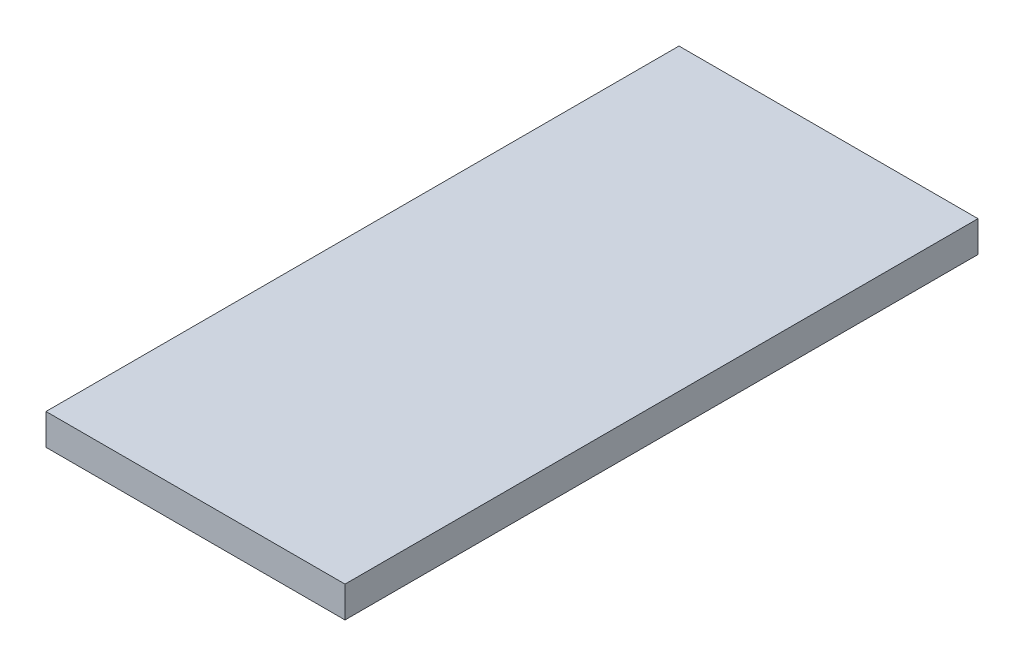
ISO-10303-21;
HEADER;
FILE_DESCRIPTION(('STEP AP214'),'2;1');
FILE_NAME('part.step','',(''),(''),'','','');
FILE_SCHEMA(('AUTOMOTIVE_DESIGN { 1 0 10303 214 1 1 1 1 }'));
ENDSEC;
DATA;
#1=APPLICATION_CONTEXT('core data for automotive mechanical design processes');
#2=APPLICATION_PROTOCOL_DEFINITION('international standard','automotive_design',2000,#1);
#3=PRODUCT_CONTEXT('',#1,'mechanical');
#4=PRODUCT('Part','Part','',(#3));
#5=PRODUCT_RELATED_PRODUCT_CATEGORY('part','',(#4));
#6=PRODUCT_DEFINITION_FORMATION('','',#4);
#7=PRODUCT_DEFINITION_CONTEXT('part definition',#1,'design');
#8=PRODUCT_DEFINITION('design','',#6,#7);
#9=PRODUCT_DEFINITION_SHAPE('','',#8);
#10=(LENGTH_UNIT() NAMED_UNIT(*) SI_UNIT(.MILLI.,.METRE.));
#11=(NAMED_UNIT(*) PLANE_ANGLE_UNIT() SI_UNIT($,.RADIAN.));
#12=(NAMED_UNIT(*) SI_UNIT($,.STERADIAN.) SOLID_ANGLE_UNIT());
#13=UNCERTAINTY_MEASURE_WITH_UNIT(LENGTH_MEASURE(1.E-05),#10,'distance_accuracy_value','');
#14=(GEOMETRIC_REPRESENTATION_CONTEXT(3) GLOBAL_UNCERTAINTY_ASSIGNED_CONTEXT((#13)) GLOBAL_UNIT_ASSIGNED_CONTEXT((#10,
#11,#12)) REPRESENTATION_CONTEXT('',''));
#15=CARTESIAN_POINT('',(0.,0.,0.));
#16=DIRECTION('',(0.,0.,1.));
#17=DIRECTION('',(1.,0.,0.));
#18=AXIS2_PLACEMENT_3D('',#15,#16,#17);
#19=CARTESIAN_POINT('',(0.,8.,0.));
#20=DIRECTION('',(1.,0.,0.));
#21=DIRECTION('',(0.,0.,-1.));
#22=AXIS2_PLACEMENT_3D('',#19,#20,#21);
#23=PLANE('',#22);
#24=DIRECTION('',(0.,0.,1.));
#25=VECTOR('',#24,1.);
#26=CARTESIAN_POINT('',(0.,0.,0.));
#27=LINE('',#26,#25);
#28=CARTESIAN_POINT('',(0.,0.,0.));
#29=VERTEX_POINT('',#28);
#30=CARTESIAN_POINT('',(0.,0.,163.));
#31=VERTEX_POINT('',#30);
#32=EDGE_CURVE('E102',#29,#31,#27,.T.);
#33=ORIENTED_EDGE('',*,*,#32,.T.);
#34=DIRECTION('',(0.,-1.,0.));
#35=VECTOR('',#34,1.);
#36=CARTESIAN_POINT('',(0.,8.,163.));
#37=LINE('',#36,#35);
#38=CARTESIAN_POINT('',(0.,8.,163.));
#39=VERTEX_POINT('',#38);
#40=EDGE_CURVE('E11',#39,#31,#37,.T.);
#41=ORIENTED_EDGE('',*,*,#40,.F.);
#42=DIRECTION('',(0.,0.,1.));
#43=VECTOR('',#42,1.);
#44=CARTESIAN_POINT('',(0.,8.,0.));
#45=LINE('',#44,#43);
#46=CARTESIAN_POINT('',(0.,8.,0.));
#47=VERTEX_POINT('',#46);
#48=EDGE_CURVE('E90',#47,#39,#45,.T.);
#49=ORIENTED_EDGE('',*,*,#48,.F.);
#50=DIRECTION('',(0.,-1.,0.));
#51=VECTOR('',#50,1.);
#52=CARTESIAN_POINT('',(0.,8.,0.));
#53=LINE('',#52,#51);
#54=EDGE_CURVE('E98',#47,#29,#53,.T.);
#55=ORIENTED_EDGE('',*,*,#54,.T.);
#56=EDGE_LOOP('',(#33,#41,#49,#55));
#57=FACE_BOUND('',#56,.T.);
#58=ADVANCED_FACE('F39',(#57),#23,.F.);
#59=CARTESIAN_POINT('',(0.,8.,163.));
#60=DIRECTION('',(0.,0.,-1.));
#61=DIRECTION('',(-1.,0.,0.));
#62=AXIS2_PLACEMENT_3D('',#59,#60,#61);
#63=PLANE('',#62);
#64=DIRECTION('',(1.,0.,0.));
#65=VECTOR('',#64,1.);
#66=CARTESIAN_POINT('',(0.,0.,163.));
#67=LINE('',#66,#65);
#68=CARTESIAN_POINT('',(77.,0.,163.));
#69=VERTEX_POINT('',#68);
#70=EDGE_CURVE('E94',#31,#69,#67,.T.);
#71=ORIENTED_EDGE('',*,*,#70,.T.);
#72=DIRECTION('',(0.,-1.,0.));
#73=VECTOR('',#72,1.);
#74=CARTESIAN_POINT('',(77.,8.,163.));
#75=LINE('',#74,#73);
#76=CARTESIAN_POINT('',(77.,8.,163.));
#77=VERTEX_POINT('',#76);
#78=EDGE_CURVE('E47',#77,#69,#75,.T.);
#79=ORIENTED_EDGE('',*,*,#78,.F.);
#80=DIRECTION('',(1.,0.,0.));
#81=VECTOR('',#80,1.);
#82=CARTESIAN_POINT('',(0.,8.,163.));
#83=LINE('',#82,#81);
#84=EDGE_CURVE('E85',#39,#77,#83,.T.);
#85=ORIENTED_EDGE('',*,*,#84,.F.);
#86=ORIENTED_EDGE('',*,*,#40,.T.);
#87=EDGE_LOOP('',(#71,#79,#85,#86));
#88=FACE_BOUND('',#87,.T.);
#89=ADVANCED_FACE('F93',(#88),#63,.F.);
#90=CARTESIAN_POINT('',(77.,8.,0.));
#91=DIRECTION('',(-1.,0.,0.));
#92=DIRECTION('',(0.,0.,1.));
#93=AXIS2_PLACEMENT_3D('',#90,#91,#92);
#94=PLANE('',#93);
#95=DIRECTION('',(0.,0.,-1.));
#96=VECTOR('',#95,1.);
#97=CARTESIAN_POINT('',(77.,0.,0.));
#98=LINE('',#97,#96);
#99=CARTESIAN_POINT('',(77.,0.,0.));
#100=VERTEX_POINT('',#99);
#101=EDGE_CURVE('E72',#69,#100,#98,.T.);
#102=ORIENTED_EDGE('',*,*,#101,.T.);
#103=DIRECTION('',(0.,-1.,0.));
#104=VECTOR('',#103,1.);
#105=CARTESIAN_POINT('',(77.,8.,0.));
#106=LINE('',#105,#104);
#107=CARTESIAN_POINT('',(77.,8.,0.));
#108=VERTEX_POINT('',#107);
#109=EDGE_CURVE('E95',#108,#100,#106,.T.);
#110=ORIENTED_EDGE('',*,*,#109,.F.);
#111=DIRECTION('',(0.,0.,-1.));
#112=VECTOR('',#111,1.);
#113=CARTESIAN_POINT('',(77.,8.,0.));
#114=LINE('',#113,#112);
#115=EDGE_CURVE('E88',#77,#108,#114,.T.);
#116=ORIENTED_EDGE('',*,*,#115,.F.);
#117=ORIENTED_EDGE('',*,*,#78,.T.);
#118=EDGE_LOOP('',(#102,#110,#116,#117));
#119=FACE_BOUND('',#118,.T.);
#120=ADVANCED_FACE('F96',(#119),#94,.F.);
#121=CARTESIAN_POINT('',(0.,8.,0.));
#122=DIRECTION('',(0.,0.,1.));
#123=DIRECTION('',(1.,0.,0.));
#124=AXIS2_PLACEMENT_3D('',#121,#122,#123);
#125=PLANE('',#124);
#126=DIRECTION('',(-1.,0.,0.));
#127=VECTOR('',#126,1.);
#128=CARTESIAN_POINT('',(0.,0.,0.));
#129=LINE('',#128,#127);
#130=EDGE_CURVE('E78',#100,#29,#129,.T.);
#131=ORIENTED_EDGE('',*,*,#130,.T.);
#132=ORIENTED_EDGE('',*,*,#54,.F.);
#133=DIRECTION('',(-1.,0.,0.));
#134=VECTOR('',#133,1.);
#135=CARTESIAN_POINT('',(0.,8.,0.));
#136=LINE('',#135,#134);
#137=EDGE_CURVE('E55',#108,#47,#136,.T.);
#138=ORIENTED_EDGE('',*,*,#137,.F.);
#139=ORIENTED_EDGE('',*,*,#109,.T.);
#140=EDGE_LOOP('',(#131,#132,#138,#139));
#141=FACE_BOUND('',#140,.T.);
#142=ADVANCED_FACE('F109',(#141),#125,.F.);
#143=CARTESIAN_POINT('',(0.,8.,0.));
#144=DIRECTION('',(0.,1.,0.));
#145=DIRECTION('',(0.,0.,1.));
#146=AXIS2_PLACEMENT_3D('',#143,#144,#145);
#147=PLANE('',#146);
#148=ORIENTED_EDGE('',*,*,#48,.T.);
#149=ORIENTED_EDGE('',*,*,#84,.T.);
#150=ORIENTED_EDGE('',*,*,#115,.T.);
#151=ORIENTED_EDGE('',*,*,#137,.T.);
#152=EDGE_LOOP('',(#148,#149,#150,#151));
#153=FACE_BOUND('',#152,.T.);
#154=ADVANCED_FACE('F86',(#153),#147,.T.);
#155=CARTESIAN_POINT('',(0.,0.,0.));
#156=DIRECTION('',(0.,1.,0.));
#157=DIRECTION('',(0.,0.,1.));
#158=AXIS2_PLACEMENT_3D('',#155,#156,#157);
#159=PLANE('',#158);
#160=ORIENTED_EDGE('',*,*,#32,.F.);
#161=ORIENTED_EDGE('',*,*,#130,.F.);
#162=ORIENTED_EDGE('',*,*,#101,.F.);
#163=ORIENTED_EDGE('',*,*,#70,.F.);
#164=EDGE_LOOP('',(#160,#161,#162,#163));
#165=FACE_BOUND('',#164,.T.);
#166=ADVANCED_FACE('F112',(#165),#159,.F.);
#167=CLOSED_SHELL('',(#58,#89,#120,#142,#154,#166));
#168=MANIFOLD_SOLID_BREP('B2',#167);
#169=ADVANCED_BREP_SHAPE_REPRESENTATION('',(#18,#168),#14);
#170=SHAPE_DEFINITION_REPRESENTATION(#9,#169);
ENDSEC;
END-ISO-10303-21;
